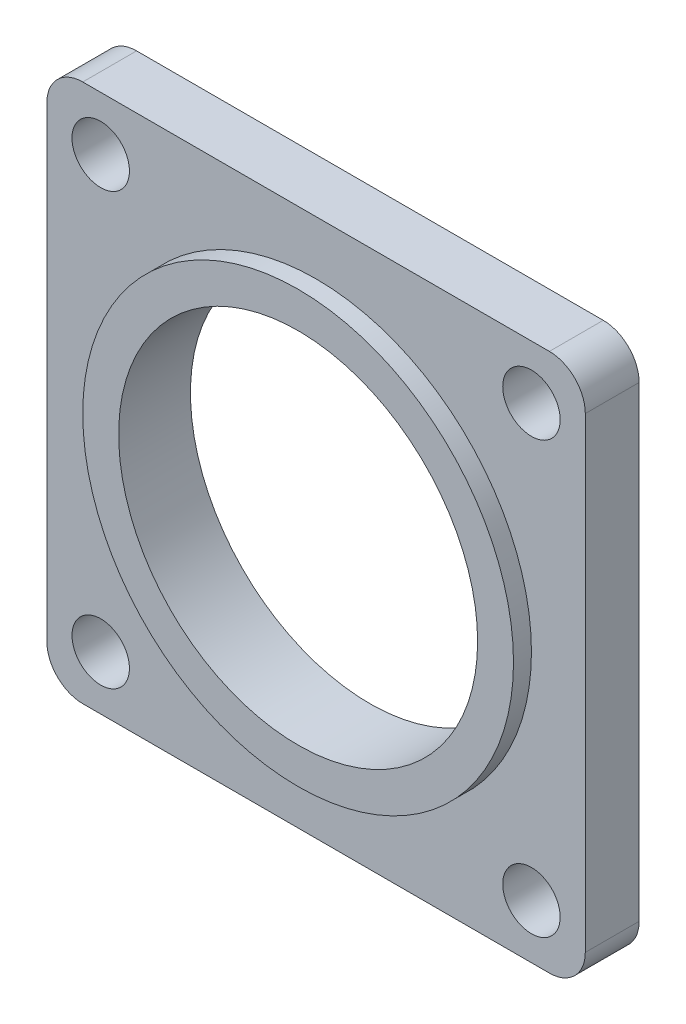
ISO-10303-21;
HEADER;
FILE_DESCRIPTION(('STEP AP214'),'2;1');
FILE_NAME('part.step','',(''),(''),'','','');
FILE_SCHEMA(('AUTOMOTIVE_DESIGN { 1 0 10303 214 1 1 1 1 }'));
ENDSEC;
DATA;
#1=APPLICATION_CONTEXT('core data for automotive mechanical design processes');
#2=APPLICATION_PROTOCOL_DEFINITION('international standard','automotive_design',2000,#1);
#3=PRODUCT_CONTEXT('',#1,'mechanical');
#4=PRODUCT('Part','Part','',(#3));
#5=PRODUCT_RELATED_PRODUCT_CATEGORY('part','',(#4));
#6=PRODUCT_DEFINITION_FORMATION('','',#4);
#7=PRODUCT_DEFINITION_CONTEXT('part definition',#1,'design');
#8=PRODUCT_DEFINITION('design','',#6,#7);
#9=PRODUCT_DEFINITION_SHAPE('','',#8);
#10=(LENGTH_UNIT() NAMED_UNIT(*) SI_UNIT(.MILLI.,.METRE.));
#11=(NAMED_UNIT(*) PLANE_ANGLE_UNIT() SI_UNIT($,.RADIAN.));
#12=(NAMED_UNIT(*) SI_UNIT($,.STERADIAN.) SOLID_ANGLE_UNIT());
#13=UNCERTAINTY_MEASURE_WITH_UNIT(LENGTH_MEASURE(1.E-05),#10,'distance_accuracy_value','');
#14=(GEOMETRIC_REPRESENTATION_CONTEXT(3) GLOBAL_UNCERTAINTY_ASSIGNED_CONTEXT((#13)) GLOBAL_UNIT_ASSIGNED_CONTEXT((#10,
#11,#12)) REPRESENTATION_CONTEXT('',''));
#15=CARTESIAN_POINT('',(0.,0.,0.));
#16=DIRECTION('',(0.,0.,1.));
#17=DIRECTION('',(1.,0.,0.));
#18=AXIS2_PLACEMENT_3D('',#15,#16,#17);
#19=CARTESIAN_POINT('',(-15.,15.,3.));
#20=DIRECTION('',(1.,0.,0.));
#21=DIRECTION('',(0.,0.,-1.));
#22=AXIS2_PLACEMENT_3D('',#19,#20,#21);
#23=PLANE('',#22);
#24=DIRECTION('',(0.,-1.,0.));
#25=VECTOR('',#24,1.);
#26=CARTESIAN_POINT('',(-15.,15.,0.));
#27=LINE('',#26,#25);
#28=CARTESIAN_POINT('',(-15.,13.,0.));
#29=VERTEX_POINT('',#28);
#30=CARTESIAN_POINT('',(-15.,-13.,0.));
#31=VERTEX_POINT('',#30);
#32=EDGE_CURVE('E142',#29,#31,#27,.T.);
#33=ORIENTED_EDGE('',*,*,#32,.T.);
#34=DIRECTION('',(0.,0.,-1.));
#35=VECTOR('',#34,1.);
#36=CARTESIAN_POINT('',(-15.,-13.,3.));
#37=LINE('',#36,#35);
#38=CARTESIAN_POINT('',(-15.,-13.,3.));
#39=VERTEX_POINT('',#38);
#40=EDGE_CURVE('E165',#31,#39,#37,.F.);
#41=ORIENTED_EDGE('',*,*,#40,.T.);
#42=DIRECTION('',(0.,-1.,0.));
#43=VECTOR('',#42,1.);
#44=CARTESIAN_POINT('',(-15.,15.,3.));
#45=LINE('',#44,#43);
#46=CARTESIAN_POINT('',(-15.,13.,3.));
#47=VERTEX_POINT('',#46);
#48=EDGE_CURVE('E140',#47,#39,#45,.T.);
#49=ORIENTED_EDGE('',*,*,#48,.F.);
#50=DIRECTION('',(0.,0.,-1.));
#51=VECTOR('',#50,1.);
#52=CARTESIAN_POINT('',(-15.,13.,3.));
#53=LINE('',#52,#51);
#54=EDGE_CURVE('E162',#47,#29,#53,.T.);
#55=ORIENTED_EDGE('',*,*,#54,.T.);
#56=EDGE_LOOP('',(#33,#41,#49,#55));
#57=FACE_BOUND('',#56,.T.);
#58=ADVANCED_FACE('F47',(#57),#23,.F.);
#59=CARTESIAN_POINT('',(-15.,-15.,3.));
#60=DIRECTION('',(0.,1.,0.));
#61=DIRECTION('',(0.,0.,1.));
#62=AXIS2_PLACEMENT_3D('',#59,#60,#61);
#63=PLANE('',#62);
#64=DIRECTION('',(1.,0.,0.));
#65=VECTOR('',#64,1.);
#66=CARTESIAN_POINT('',(-15.,-15.,0.));
#67=LINE('',#66,#65);
#68=CARTESIAN_POINT('',(-13.,-15.,0.));
#69=VERTEX_POINT('',#68);
#70=CARTESIAN_POINT('',(13.,-15.,0.));
#71=VERTEX_POINT('',#70);
#72=EDGE_CURVE('E138',#69,#71,#67,.T.);
#73=ORIENTED_EDGE('',*,*,#72,.T.);
#74=DIRECTION('',(0.,0.,-1.));
#75=VECTOR('',#74,1.);
#76=CARTESIAN_POINT('',(13.,-15.,3.));
#77=LINE('',#76,#75);
#78=CARTESIAN_POINT('',(13.,-15.,3.));
#79=VERTEX_POINT('',#78);
#80=EDGE_CURVE('E117',#71,#79,#77,.F.);
#81=ORIENTED_EDGE('',*,*,#80,.T.);
#82=DIRECTION('',(1.,0.,0.));
#83=VECTOR('',#82,1.);
#84=CARTESIAN_POINT('',(-15.,-15.,3.));
#85=LINE('',#84,#83);
#86=CARTESIAN_POINT('',(-13.,-15.,3.));
#87=VERTEX_POINT('',#86);
#88=EDGE_CURVE('E182',#87,#79,#85,.T.);
#89=ORIENTED_EDGE('',*,*,#88,.F.);
#90=DIRECTION('',(0.,0.,-1.));
#91=VECTOR('',#90,1.);
#92=CARTESIAN_POINT('',(-13.,-15.,3.));
#93=LINE('',#92,#91);
#94=EDGE_CURVE('E122',#87,#69,#93,.T.);
#95=ORIENTED_EDGE('',*,*,#94,.T.);
#96=EDGE_LOOP('',(#73,#81,#89,#95));
#97=FACE_BOUND('',#96,.T.);
#98=ADVANCED_FACE('F254',(#97),#63,.F.);
#99=CARTESIAN_POINT('',(15.,15.,3.));
#100=DIRECTION('',(-1.,0.,0.));
#101=DIRECTION('',(0.,0.,1.));
#102=AXIS2_PLACEMENT_3D('',#99,#100,#101);
#103=PLANE('',#102);
#104=DIRECTION('',(0.,1.,0.));
#105=VECTOR('',#104,1.);
#106=CARTESIAN_POINT('',(15.,15.,3.));
#107=LINE('',#106,#105);
#108=CARTESIAN_POINT('',(15.,-13.,3.));
#109=VERTEX_POINT('',#108);
#110=CARTESIAN_POINT('',(15.,13.,3.));
#111=VERTEX_POINT('',#110);
#112=EDGE_CURVE('E131',#109,#111,#107,.T.);
#113=ORIENTED_EDGE('',*,*,#112,.F.);
#114=DIRECTION('',(0.,0.,-1.));
#115=VECTOR('',#114,1.);
#116=CARTESIAN_POINT('',(15.,-13.,3.));
#117=LINE('',#116,#115);
#118=CARTESIAN_POINT('',(15.,-13.,0.));
#119=VERTEX_POINT('',#118);
#120=EDGE_CURVE('E116',#109,#119,#117,.T.);
#121=ORIENTED_EDGE('',*,*,#120,.T.);
#122=DIRECTION('',(0.,1.,0.));
#123=VECTOR('',#122,1.);
#124=CARTESIAN_POINT('',(15.,15.,0.));
#125=LINE('',#124,#123);
#126=CARTESIAN_POINT('',(15.,13.,0.));
#127=VERTEX_POINT('',#126);
#128=EDGE_CURVE('E129',#119,#127,#125,.T.);
#129=ORIENTED_EDGE('',*,*,#128,.T.);
#130=DIRECTION('',(0.,0.,-1.));
#131=VECTOR('',#130,1.);
#132=CARTESIAN_POINT('',(15.,13.,3.));
#133=LINE('',#132,#131);
#134=EDGE_CURVE('E133',#127,#111,#133,.F.);
#135=ORIENTED_EDGE('',*,*,#134,.T.);
#136=EDGE_LOOP('',(#113,#121,#129,#135));
#137=FACE_BOUND('',#136,.T.);
#138=ADVANCED_FACE('F128',(#137),#103,.F.);
#139=CARTESIAN_POINT('',(-15.,15.,3.));
#140=DIRECTION('',(0.,-1.,0.));
#141=DIRECTION('',(0.,0.,-1.));
#142=AXIS2_PLACEMENT_3D('',#139,#140,#141);
#143=PLANE('',#142);
#144=DIRECTION('',(-1.,0.,0.));
#145=VECTOR('',#144,1.);
#146=CARTESIAN_POINT('',(-15.,15.,0.));
#147=LINE('',#146,#145);
#148=CARTESIAN_POINT('',(13.,15.,0.));
#149=VERTEX_POINT('',#148);
#150=CARTESIAN_POINT('',(-13.,15.,0.));
#151=VERTEX_POINT('',#150);
#152=EDGE_CURVE('E137',#149,#151,#147,.T.);
#153=ORIENTED_EDGE('',*,*,#152,.T.);
#154=DIRECTION('',(0.,0.,-1.));
#155=VECTOR('',#154,1.);
#156=CARTESIAN_POINT('',(-13.,15.,3.));
#157=LINE('',#156,#155);
#158=CARTESIAN_POINT('',(-13.,15.,3.));
#159=VERTEX_POINT('',#158);
#160=EDGE_CURVE('E12',#151,#159,#157,.F.);
#161=ORIENTED_EDGE('',*,*,#160,.T.);
#162=DIRECTION('',(-1.,0.,0.));
#163=VECTOR('',#162,1.);
#164=CARTESIAN_POINT('',(-15.,15.,3.));
#165=LINE('',#164,#163);
#166=CARTESIAN_POINT('',(13.,15.,3.));
#167=VERTEX_POINT('',#166);
#168=EDGE_CURVE('E169',#167,#159,#165,.T.);
#169=ORIENTED_EDGE('',*,*,#168,.F.);
#170=DIRECTION('',(0.,0.,-1.));
#171=VECTOR('',#170,1.);
#172=CARTESIAN_POINT('',(13.,15.,3.));
#173=LINE('',#172,#171);
#174=EDGE_CURVE('E55',#167,#149,#173,.T.);
#175=ORIENTED_EDGE('',*,*,#174,.T.);
#176=EDGE_LOOP('',(#153,#161,#169,#175));
#177=FACE_BOUND('',#176,.T.);
#178=ADVANCED_FACE('F168',(#177),#143,.F.);
#179=CARTESIAN_POINT('',(0.,0.,3.));
#180=DIRECTION('',(0.,0.,1.));
#181=DIRECTION('',(1.,0.,0.));
#182=AXIS2_PLACEMENT_3D('',#179,#180,#181);
#183=PLANE('',#182);
#184=CARTESIAN_POINT('',(12.,-12.,3.));
#185=DIRECTION('',(0.,0.,1.));
#186=DIRECTION('',(1.,0.,0.));
#187=AXIS2_PLACEMENT_3D('',#184,#185,#186);
#188=CIRCLE('',#187,1.6);
#189=CARTESIAN_POINT('',(13.6,-12.,3.));
#190=VERTEX_POINT('',#189);
#191=EDGE_CURVE('E200',#190,#190,#188,.T.);
#192=ORIENTED_EDGE('',*,*,#191,.F.);
#193=EDGE_LOOP('',(#192));
#194=FACE_BOUND('',#193,.T.);
#195=CARTESIAN_POINT('',(-12.,-12.,3.));
#196=DIRECTION('',(0.,0.,1.));
#197=DIRECTION('',(1.,0.,0.));
#198=AXIS2_PLACEMENT_3D('',#195,#196,#197);
#199=CIRCLE('',#198,1.6);
#200=CARTESIAN_POINT('',(-10.4,-12.,3.));
#201=VERTEX_POINT('',#200);
#202=EDGE_CURVE('E204',#201,#201,#199,.T.);
#203=ORIENTED_EDGE('',*,*,#202,.F.);
#204=EDGE_LOOP('',(#203));
#205=FACE_BOUND('',#204,.T.);
#206=CARTESIAN_POINT('',(-12.,12.,3.));
#207=DIRECTION('',(0.,0.,1.));
#208=DIRECTION('',(1.,0.,0.));
#209=AXIS2_PLACEMENT_3D('',#206,#207,#208);
#210=CIRCLE('',#209,1.6);
#211=CARTESIAN_POINT('',(-10.4,12.,3.));
#212=VERTEX_POINT('',#211);
#213=EDGE_CURVE('E207',#212,#212,#210,.T.);
#214=ORIENTED_EDGE('',*,*,#213,.F.);
#215=EDGE_LOOP('',(#214));
#216=FACE_BOUND('',#215,.T.);
#217=CARTESIAN_POINT('',(12.,12.,3.));
#218=DIRECTION('',(0.,0.,1.));
#219=DIRECTION('',(1.,0.,0.));
#220=AXIS2_PLACEMENT_3D('',#217,#218,#219);
#221=CIRCLE('',#220,1.6);
#222=CARTESIAN_POINT('',(13.6,12.,3.));
#223=VERTEX_POINT('',#222);
#224=EDGE_CURVE('E210',#223,#223,#221,.T.);
#225=ORIENTED_EDGE('',*,*,#224,.F.);
#226=EDGE_LOOP('',(#225));
#227=FACE_BOUND('',#226,.T.);
#228=CARTESIAN_POINT('',(0.,0.,3.));
#229=DIRECTION('',(0.,0.,1.));
#230=DIRECTION('',(1.,0.,0.));
#231=AXIS2_PLACEMENT_3D('',#228,#229,#230);
#232=CIRCLE('',#231,12.);
#233=CARTESIAN_POINT('',(12.,0.,3.));
#234=VERTEX_POINT('',#233);
#235=EDGE_CURVE('E146',#234,#234,#232,.T.);
#236=ORIENTED_EDGE('',*,*,#235,.F.);
#237=EDGE_LOOP('',(#236));
#238=FACE_BOUND('',#237,.T.);
#239=ORIENTED_EDGE('',*,*,#88,.T.);
#240=CARTESIAN_POINT('',(13.,-13.,3.));
#241=DIRECTION('',(0.,0.,1.));
#242=DIRECTION('',(1.,0.,0.));
#243=AXIS2_PLACEMENT_3D('',#240,#241,#242);
#244=CIRCLE('',#243,2.);
#245=EDGE_CURVE('E160',#79,#109,#244,.T.);
#246=ORIENTED_EDGE('',*,*,#245,.T.);
#247=ORIENTED_EDGE('',*,*,#112,.T.);
#248=CARTESIAN_POINT('',(13.,13.,3.));
#249=DIRECTION('',(0.,0.,1.));
#250=DIRECTION('',(1.,0.,0.));
#251=AXIS2_PLACEMENT_3D('',#248,#249,#250);
#252=CIRCLE('',#251,2.);
#253=EDGE_CURVE('E67',#111,#167,#252,.T.);
#254=ORIENTED_EDGE('',*,*,#253,.T.);
#255=ORIENTED_EDGE('',*,*,#168,.T.);
#256=CARTESIAN_POINT('',(-13.,13.,3.));
#257=DIRECTION('',(0.,0.,1.));
#258=DIRECTION('',(1.,0.,0.));
#259=AXIS2_PLACEMENT_3D('',#256,#257,#258);
#260=CIRCLE('',#259,2.);
#261=EDGE_CURVE('E156',#159,#47,#260,.T.);
#262=ORIENTED_EDGE('',*,*,#261,.T.);
#263=ORIENTED_EDGE('',*,*,#48,.T.);
#264=CARTESIAN_POINT('',(-13.,-13.,3.));
#265=DIRECTION('',(0.,0.,1.));
#266=DIRECTION('',(1.,0.,0.));
#267=AXIS2_PLACEMENT_3D('',#264,#265,#266);
#268=CIRCLE('',#267,2.);
#269=EDGE_CURVE('E158',#39,#87,#268,.T.);
#270=ORIENTED_EDGE('',*,*,#269,.T.);
#271=EDGE_LOOP('',(#239,#246,#247,#254,#255,#262,#263,#270));
#272=FACE_BOUND('',#271,.T.);
#273=ADVANCED_FACE('F231',(#194,#205,#216,#227,#238,#272),#183,.T.);
#274=CARTESIAN_POINT('',(0.,0.,0.));
#275=DIRECTION('',(0.,0.,1.));
#276=DIRECTION('',(1.,0.,0.));
#277=AXIS2_PLACEMENT_3D('',#274,#275,#276);
#278=PLANE('',#277);
#279=CARTESIAN_POINT('',(12.,-12.,0.));
#280=DIRECTION('',(0.,0.,-1.));
#281=DIRECTION('',(1.,0.,0.));
#282=AXIS2_PLACEMENT_3D('',#279,#280,#281);
#283=CIRCLE('',#282,1.6);
#284=CARTESIAN_POINT('',(13.6,-12.,0.));
#285=VERTEX_POINT('',#284);
#286=EDGE_CURVE('E217',#285,#285,#283,.T.);
#287=ORIENTED_EDGE('',*,*,#286,.F.);
#288=EDGE_LOOP('',(#287));
#289=FACE_BOUND('',#288,.T.);
#290=CARTESIAN_POINT('',(-12.,-12.,0.));
#291=DIRECTION('',(0.,0.,-1.));
#292=DIRECTION('',(1.,0.,0.));
#293=AXIS2_PLACEMENT_3D('',#290,#291,#292);
#294=CIRCLE('',#293,1.6);
#295=CARTESIAN_POINT('',(-10.4,-12.,0.));
#296=VERTEX_POINT('',#295);
#297=EDGE_CURVE('E220',#296,#296,#294,.T.);
#298=ORIENTED_EDGE('',*,*,#297,.F.);
#299=EDGE_LOOP('',(#298));
#300=FACE_BOUND('',#299,.T.);
#301=CARTESIAN_POINT('',(-12.,12.,0.));
#302=DIRECTION('',(0.,0.,-1.));
#303=DIRECTION('',(-1.,0.,0.));
#304=AXIS2_PLACEMENT_3D('',#301,#302,#303);
#305=CIRCLE('',#304,1.6);
#306=CARTESIAN_POINT('',(-13.6,12.,0.));
#307=VERTEX_POINT('',#306);
#308=EDGE_CURVE('E216',#307,#307,#305,.T.);
#309=ORIENTED_EDGE('',*,*,#308,.F.);
#310=EDGE_LOOP('',(#309));
#311=FACE_BOUND('',#310,.T.);
#312=CARTESIAN_POINT('',(12.,12.,0.));
#313=DIRECTION('',(0.,0.,-1.));
#314=DIRECTION('',(-1.,0.,0.));
#315=AXIS2_PLACEMENT_3D('',#312,#313,#314);
#316=CIRCLE('',#315,1.6);
#317=CARTESIAN_POINT('',(10.4,12.,0.));
#318=VERTEX_POINT('',#317);
#319=EDGE_CURVE('E213',#318,#318,#316,.T.);
#320=ORIENTED_EDGE('',*,*,#319,.F.);
#321=EDGE_LOOP('',(#320));
#322=FACE_BOUND('',#321,.T.);
#323=CARTESIAN_POINT('',(0.,0.,0.));
#324=DIRECTION('',(0.,0.,1.));
#325=DIRECTION('',(1.,0.,0.));
#326=AXIS2_PLACEMENT_3D('',#323,#324,#325);
#327=CIRCLE('',#326,10.);
#328=CARTESIAN_POINT('',(10.,0.,0.));
#329=VERTEX_POINT('',#328);
#330=EDGE_CURVE('E192',#329,#329,#327,.T.);
#331=ORIENTED_EDGE('',*,*,#330,.T.);
#332=EDGE_LOOP('',(#331));
#333=FACE_BOUND('',#332,.T.);
#334=ORIENTED_EDGE('',*,*,#128,.F.);
#335=CARTESIAN_POINT('',(13.,-13.,0.));
#336=DIRECTION('',(0.,0.,1.));
#337=DIRECTION('',(1.,0.,0.));
#338=AXIS2_PLACEMENT_3D('',#335,#336,#337);
#339=CIRCLE('',#338,2.);
#340=EDGE_CURVE('E112',#119,#71,#339,.F.);
#341=ORIENTED_EDGE('',*,*,#340,.T.);
#342=ORIENTED_EDGE('',*,*,#72,.F.);
#343=CARTESIAN_POINT('',(-13.,-13.,0.));
#344=DIRECTION('',(0.,0.,1.));
#345=DIRECTION('',(1.,0.,0.));
#346=AXIS2_PLACEMENT_3D('',#343,#344,#345);
#347=CIRCLE('',#346,2.);
#348=EDGE_CURVE('E123',#69,#31,#347,.F.);
#349=ORIENTED_EDGE('',*,*,#348,.T.);
#350=ORIENTED_EDGE('',*,*,#32,.F.);
#351=CARTESIAN_POINT('',(-13.,13.,0.));
#352=DIRECTION('',(0.,0.,1.));
#353=DIRECTION('',(1.,0.,0.));
#354=AXIS2_PLACEMENT_3D('',#351,#352,#353);
#355=CIRCLE('',#354,2.);
#356=EDGE_CURVE('E149',#29,#151,#355,.F.);
#357=ORIENTED_EDGE('',*,*,#356,.T.);
#358=ORIENTED_EDGE('',*,*,#152,.F.);
#359=CARTESIAN_POINT('',(13.,13.,0.));
#360=DIRECTION('',(0.,0.,1.));
#361=DIRECTION('',(1.,0.,0.));
#362=AXIS2_PLACEMENT_3D('',#359,#360,#361);
#363=CIRCLE('',#362,2.);
#364=EDGE_CURVE('E132',#149,#127,#363,.F.);
#365=ORIENTED_EDGE('',*,*,#364,.T.);
#366=EDGE_LOOP('',(#334,#341,#342,#349,#350,#357,#358,#365));
#367=FACE_BOUND('',#366,.T.);
#368=ADVANCED_FACE('F135',(#289,#300,#311,#322,#333,#367),#278,.F.);
#369=CARTESIAN_POINT('',(0.,0.,4.));
#370=DIRECTION('',(0.,0.,-1.));
#371=DIRECTION('',(-1.,0.,0.));
#372=AXIS2_PLACEMENT_3D('',#369,#370,#371);
#373=CYLINDRICAL_SURFACE('',#372,12.);
#374=CARTESIAN_POINT('',(0.,0.,4.));
#375=DIRECTION('',(0.,0.,1.));
#376=DIRECTION('',(1.,0.,0.));
#377=AXIS2_PLACEMENT_3D('',#374,#375,#376);
#378=CIRCLE('',#377,12.);
#379=CARTESIAN_POINT('',(12.,0.,4.));
#380=VERTEX_POINT('',#379);
#381=EDGE_CURVE('E190',#380,#380,#378,.T.);
#382=ORIENTED_EDGE('',*,*,#381,.F.);
#383=EDGE_LOOP('',(#382));
#384=FACE_BOUND('',#383,.T.);
#385=ORIENTED_EDGE('',*,*,#235,.T.);
#386=EDGE_LOOP('',(#385));
#387=FACE_BOUND('',#386,.T.);
#388=ADVANCED_FACE('F230',(#384,#387),#373,.T.);
#389=CARTESIAN_POINT('',(0.,0.,4.));
#390=DIRECTION('',(0.,0.,1.));
#391=DIRECTION('',(1.,0.,0.));
#392=AXIS2_PLACEMENT_3D('',#389,#390,#391);
#393=PLANE('',#392);
#394=CARTESIAN_POINT('',(0.,0.,4.));
#395=DIRECTION('',(0.,0.,1.));
#396=DIRECTION('',(1.,0.,0.));
#397=AXIS2_PLACEMENT_3D('',#394,#395,#396);
#398=CIRCLE('',#397,10.);
#399=CARTESIAN_POINT('',(10.,0.,4.));
#400=VERTEX_POINT('',#399);
#401=EDGE_CURVE('E196',#400,#400,#398,.T.);
#402=ORIENTED_EDGE('',*,*,#401,.F.);
#403=EDGE_LOOP('',(#402));
#404=FACE_BOUND('',#403,.T.);
#405=ORIENTED_EDGE('',*,*,#381,.T.);
#406=EDGE_LOOP('',(#405));
#407=FACE_BOUND('',#406,.T.);
#408=ADVANCED_FACE('F242',(#404,#407),#393,.T.);
#409=CARTESIAN_POINT('',(0.,0.,0.));
#410=DIRECTION('',(0.,0.,1.));
#411=DIRECTION('',(1.,0.,0.));
#412=AXIS2_PLACEMENT_3D('',#409,#410,#411);
#413=CYLINDRICAL_SURFACE('',#412,10.);
#414=ORIENTED_EDGE('',*,*,#330,.F.);
#415=EDGE_LOOP('',(#414));
#416=FACE_BOUND('',#415,.T.);
#417=ORIENTED_EDGE('',*,*,#401,.T.);
#418=EDGE_LOOP('',(#417));
#419=FACE_BOUND('',#418,.T.);
#420=ADVANCED_FACE('F238',(#416,#419),#413,.F.);
#421=CARTESIAN_POINT('',(12.,12.,4.));
#422=DIRECTION('',(0.,0.,-1.));
#423=DIRECTION('',(-1.,0.,0.));
#424=AXIS2_PLACEMENT_3D('',#421,#422,#423);
#425=CYLINDRICAL_SURFACE('',#424,1.6);
#426=ORIENTED_EDGE('',*,*,#224,.T.);
#427=EDGE_LOOP('',(#426));
#428=FACE_BOUND('',#427,.T.);
#429=ORIENTED_EDGE('',*,*,#319,.T.);
#430=EDGE_LOOP('',(#429));
#431=FACE_BOUND('',#430,.T.);
#432=ADVANCED_FACE('F241',(#428,#431),#425,.F.);
#433=CARTESIAN_POINT('',(-12.,12.,4.));
#434=DIRECTION('',(0.,0.,-1.));
#435=DIRECTION('',(-1.,0.,0.));
#436=AXIS2_PLACEMENT_3D('',#433,#434,#435);
#437=CYLINDRICAL_SURFACE('',#436,1.6);
#438=ORIENTED_EDGE('',*,*,#213,.T.);
#439=EDGE_LOOP('',(#438));
#440=FACE_BOUND('',#439,.T.);
#441=ORIENTED_EDGE('',*,*,#308,.T.);
#442=EDGE_LOOP('',(#441));
#443=FACE_BOUND('',#442,.T.);
#444=ADVANCED_FACE('F226',(#440,#443),#437,.F.);
#445=CARTESIAN_POINT('',(-12.,-12.,4.));
#446=DIRECTION('',(0.,0.,-1.));
#447=DIRECTION('',(-1.,0.,0.));
#448=AXIS2_PLACEMENT_3D('',#445,#446,#447);
#449=CYLINDRICAL_SURFACE('',#448,1.6);
#450=ORIENTED_EDGE('',*,*,#202,.T.);
#451=EDGE_LOOP('',(#450));
#452=FACE_BOUND('',#451,.T.);
#453=ORIENTED_EDGE('',*,*,#297,.T.);
#454=EDGE_LOOP('',(#453));
#455=FACE_BOUND('',#454,.T.);
#456=ADVANCED_FACE('F329',(#452,#455),#449,.F.);
#457=CARTESIAN_POINT('',(12.,-12.,4.));
#458=DIRECTION('',(0.,0.,-1.));
#459=DIRECTION('',(-1.,0.,0.));
#460=AXIS2_PLACEMENT_3D('',#457,#458,#459);
#461=CYLINDRICAL_SURFACE('',#460,1.6);
#462=ORIENTED_EDGE('',*,*,#191,.T.);
#463=EDGE_LOOP('',(#462));
#464=FACE_BOUND('',#463,.T.);
#465=ORIENTED_EDGE('',*,*,#286,.T.);
#466=EDGE_LOOP('',(#465));
#467=FACE_BOUND('',#466,.T.);
#468=ADVANCED_FACE('F267',(#464,#467),#461,.F.);
#469=CARTESIAN_POINT('',(13.,-13.,3.));
#470=DIRECTION('',(0.,0.,-1.));
#471=DIRECTION('',(-1.,0.,0.));
#472=AXIS2_PLACEMENT_3D('',#469,#470,#471);
#473=CYLINDRICAL_SURFACE('',#472,2.);
#474=ORIENTED_EDGE('',*,*,#245,.F.);
#475=ORIENTED_EDGE('',*,*,#80,.F.);
#476=ORIENTED_EDGE('',*,*,#340,.F.);
#477=ORIENTED_EDGE('',*,*,#120,.F.);
#478=EDGE_LOOP('',(#474,#475,#476,#477));
#479=FACE_BOUND('',#478,.T.);
#480=ADVANCED_FACE('F115',(#479),#473,.T.);
#481=CARTESIAN_POINT('',(-13.,-13.,3.));
#482=DIRECTION('',(0.,0.,-1.));
#483=DIRECTION('',(-1.,0.,0.));
#484=AXIS2_PLACEMENT_3D('',#481,#482,#483);
#485=CYLINDRICAL_SURFACE('',#484,2.);
#486=ORIENTED_EDGE('',*,*,#269,.F.);
#487=ORIENTED_EDGE('',*,*,#40,.F.);
#488=ORIENTED_EDGE('',*,*,#348,.F.);
#489=ORIENTED_EDGE('',*,*,#94,.F.);
#490=EDGE_LOOP('',(#486,#487,#488,#489));
#491=FACE_BOUND('',#490,.T.);
#492=ADVANCED_FACE('F266',(#491),#485,.T.);
#493=CARTESIAN_POINT('',(-13.,13.,3.));
#494=DIRECTION('',(0.,0.,-1.));
#495=DIRECTION('',(-1.,0.,0.));
#496=AXIS2_PLACEMENT_3D('',#493,#494,#495);
#497=CYLINDRICAL_SURFACE('',#496,2.);
#498=ORIENTED_EDGE('',*,*,#261,.F.);
#499=ORIENTED_EDGE('',*,*,#160,.F.);
#500=ORIENTED_EDGE('',*,*,#356,.F.);
#501=ORIENTED_EDGE('',*,*,#54,.F.);
#502=EDGE_LOOP('',(#498,#499,#500,#501));
#503=FACE_BOUND('',#502,.T.);
#504=ADVANCED_FACE('F176',(#503),#497,.T.);
#505=CARTESIAN_POINT('',(13.,13.,3.));
#506=DIRECTION('',(0.,0.,-1.));
#507=DIRECTION('',(-1.,0.,0.));
#508=AXIS2_PLACEMENT_3D('',#505,#506,#507);
#509=CYLINDRICAL_SURFACE('',#508,2.);
#510=ORIENTED_EDGE('',*,*,#253,.F.);
#511=ORIENTED_EDGE('',*,*,#134,.F.);
#512=ORIENTED_EDGE('',*,*,#364,.F.);
#513=ORIENTED_EDGE('',*,*,#174,.F.);
#514=EDGE_LOOP('',(#510,#511,#512,#513));
#515=FACE_BOUND('',#514,.T.);
#516=ADVANCED_FACE('F49',(#515),#509,.T.);
#517=CLOSED_SHELL('',(#58,#98,#138,#178,#273,#368,#388,#408,#420,#432,#444,#456,#468,#480,#492,
#504,#516));
#518=MANIFOLD_SOLID_BREP('B2',#517);
#519=ADVANCED_BREP_SHAPE_REPRESENTATION('',(#18,#518),#14);
#520=SHAPE_DEFINITION_REPRESENTATION(#9,#519);
ENDSEC;
END-ISO-10303-21;
